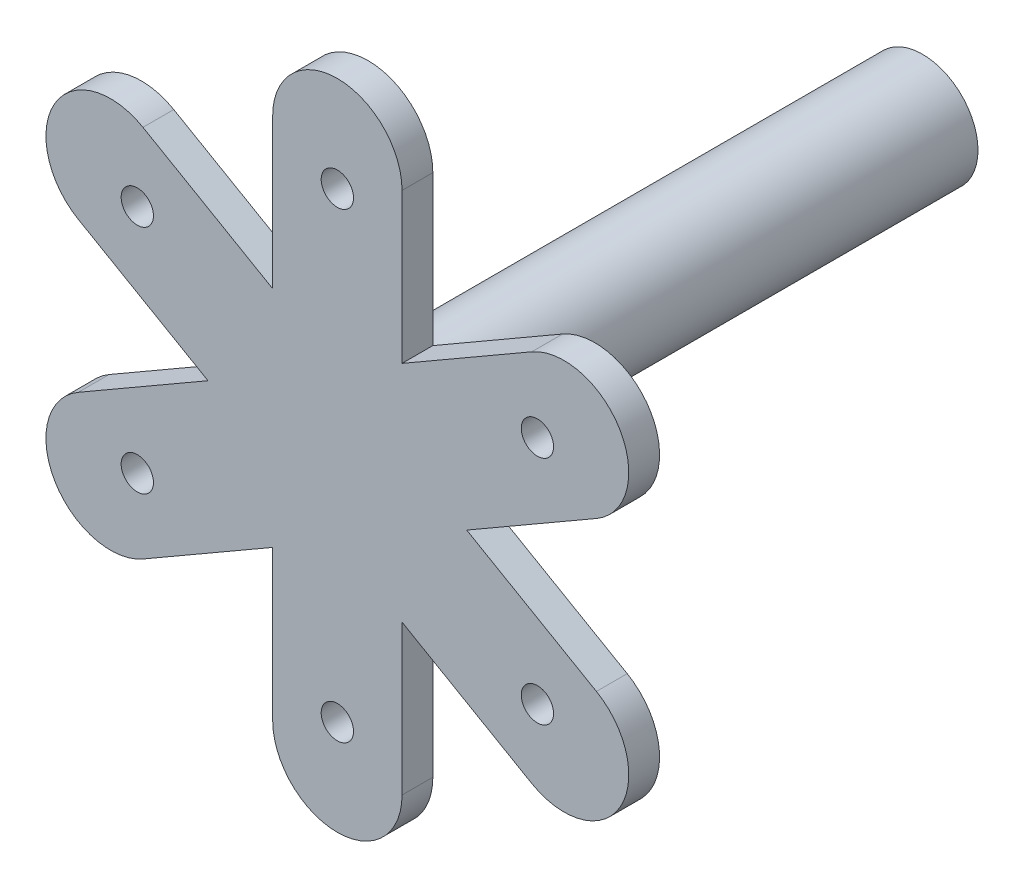
ISO-10303-21;
HEADER;
FILE_DESCRIPTION(('STEP AP214'),'2;1');
FILE_NAME('part.step','',(''),(''),'','','');
FILE_SCHEMA(('AUTOMOTIVE_DESIGN { 1 0 10303 214 1 1 1 1 }'));
ENDSEC;
DATA;
#1=APPLICATION_CONTEXT('core data for automotive mechanical design processes');
#2=APPLICATION_PROTOCOL_DEFINITION('international standard','automotive_design',2000,#1);
#3=PRODUCT_CONTEXT('',#1,'mechanical');
#4=PRODUCT('Part','Part','',(#3));
#5=PRODUCT_RELATED_PRODUCT_CATEGORY('part','',(#4));
#6=PRODUCT_DEFINITION_FORMATION('','',#4);
#7=PRODUCT_DEFINITION_CONTEXT('part definition',#1,'design');
#8=PRODUCT_DEFINITION('design','',#6,#7);
#9=PRODUCT_DEFINITION_SHAPE('','',#8);
#10=(LENGTH_UNIT() NAMED_UNIT(*) SI_UNIT(.MILLI.,.METRE.));
#11=(NAMED_UNIT(*) PLANE_ANGLE_UNIT() SI_UNIT($,.RADIAN.));
#12=(NAMED_UNIT(*) SI_UNIT($,.STERADIAN.) SOLID_ANGLE_UNIT());
#13=UNCERTAINTY_MEASURE_WITH_UNIT(LENGTH_MEASURE(1.E-05),#10,'distance_accuracy_value','');
#14=(GEOMETRIC_REPRESENTATION_CONTEXT(3) GLOBAL_UNCERTAINTY_ASSIGNED_CONTEXT((#13)) GLOBAL_UNIT_ASSIGNED_CONTEXT((#10,
#11,#12)) REPRESENTATION_CONTEXT('',''));
#15=CARTESIAN_POINT('',(0.,0.,0.));
#16=DIRECTION('',(0.,0.,1.));
#17=DIRECTION('',(1.,0.,0.));
#18=AXIS2_PLACEMENT_3D('',#15,#16,#17);
#19=CARTESIAN_POINT('',(-26.3060796608388,-45.5634665205269,10.));
#20=DIRECTION('',(0.500000000000002,0.866025403784438,0.));
#21=DIRECTION('',(-0.866025403784438,0.500000000000002,0.));
#22=AXIS2_PLACEMENT_3D('',#19,#20,#21);
#23=PLANE('',#22);
#24=DIRECTION('',(0.866025403784438,-0.500000000000002,0.));
#25=VECTOR('',#24,1.);
#26=CARTESIAN_POINT('',(-26.3060796608388,-45.5634665205269,0.));
#27=LINE('',#26,#25);
#28=CARTESIAN_POINT('',(-63.1121593216815,-24.3134665205245,0.));
#29=VERTEX_POINT('',#28);
#30=CARTESIAN_POINT('',(-21.0000000000002,-48.6269330410537,0.));
#31=VERTEX_POINT('',#30);
#32=EDGE_CURVE('E219',#29,#31,#27,.T.);
#33=ORIENTED_EDGE('',*,*,#32,.F.);
#34=DIRECTION('',(0.,0.,-1.));
#35=VECTOR('',#34,1.);
#36=CARTESIAN_POINT('',(-63.1121593216815,-24.3134665205245,10.));
#37=LINE('',#36,#35);
#38=CARTESIAN_POINT('',(-63.1121593216815,-24.3134665205245,10.));
#39=VERTEX_POINT('',#38);
#40=EDGE_CURVE('E50',#39,#29,#37,.T.);
#41=ORIENTED_EDGE('',*,*,#40,.F.);
#42=DIRECTION('',(0.866025403784438,-0.500000000000002,0.));
#43=VECTOR('',#42,1.);
#44=CARTESIAN_POINT('',(-26.3060796608388,-45.5634665205269,10.));
#45=LINE('',#44,#43);
#46=CARTESIAN_POINT('',(-21.0000000000002,-48.6269330410537,10.));
#47=VERTEX_POINT('',#46);
#48=EDGE_CURVE('E487',#39,#47,#45,.T.);
#49=ORIENTED_EDGE('',*,*,#48,.T.);
#50=DIRECTION('',(0.,0.,-1.));
#51=VECTOR('',#50,1.);
#52=CARTESIAN_POINT('',(-21.0000000000002,-48.6269330410537,10.));
#53=LINE('',#52,#51);
#54=EDGE_CURVE('E124',#47,#31,#53,.T.);
#55=ORIENTED_EDGE('',*,*,#54,.T.);
#56=EDGE_LOOP('',(#33,#41,#49,#55));
#57=FACE_BOUND('',#56,.T.);
#58=ADVANCED_FACE('F41',(#57),#23,.T.);
#59=CARTESIAN_POINT('',(-73.6121593216769,-42.4999999999996,10.));
#60=DIRECTION('',(0.,0.,-1.));
#61=DIRECTION('',(-1.,0.,0.));
#62=AXIS2_PLACEMENT_3D('',#59,#60,#61);
#63=CYLINDRICAL_SURFACE('',#62,21.);
#64=CARTESIAN_POINT('',(-73.6121593216769,-42.4999999999996,0.));
#65=DIRECTION('',(0.,0.,1.));
#66=DIRECTION('',(1.,0.,0.));
#67=AXIS2_PLACEMENT_3D('',#64,#65,#66);
#68=CIRCLE('',#67,21.);
#69=CARTESIAN_POINT('',(-84.1121593216819,-60.6865334794706,0.));
#70=VERTEX_POINT('',#69);
#71=EDGE_CURVE('E221',#29,#70,#68,.T.);
#72=ORIENTED_EDGE('',*,*,#71,.T.);
#73=DIRECTION('',(0.,0.,-1.));
#74=VECTOR('',#73,1.);
#75=CARTESIAN_POINT('',(-84.1121593216819,-60.6865334794706,10.));
#76=LINE('',#75,#74);
#77=CARTESIAN_POINT('',(-84.1121593216819,-60.6865334794706,10.));
#78=VERTEX_POINT('',#77);
#79=EDGE_CURVE('E299',#78,#70,#76,.T.);
#80=ORIENTED_EDGE('',*,*,#79,.F.);
#81=CARTESIAN_POINT('',(-73.6121593216769,-42.4999999999996,10.));
#82=DIRECTION('',(0.,0.,1.));
#83=DIRECTION('',(1.,0.,0.));
#84=AXIS2_PLACEMENT_3D('',#81,#82,#83);
#85=CIRCLE('',#84,21.);
#86=EDGE_CURVE('E306',#39,#78,#85,.T.);
#87=ORIENTED_EDGE('',*,*,#86,.F.);
#88=ORIENTED_EDGE('',*,*,#40,.T.);
#89=EDGE_LOOP('',(#72,#80,#87,#88));
#90=FACE_BOUND('',#89,.T.);
#91=ADVANCED_FACE('F303',(#90),#63,.T.);
#92=CARTESIAN_POINT('',(-47.3060796608389,-81.9365334794733,10.));
#93=DIRECTION('',(0.500000000000002,0.866025403784438,0.));
#94=DIRECTION('',(-0.866025403784438,0.500000000000002,0.));
#95=AXIS2_PLACEMENT_3D('',#92,#93,#94);
#96=PLANE('',#95);
#97=DIRECTION('',(0.866025403784438,-0.500000000000002,0.));
#98=VECTOR('',#97,1.);
#99=CARTESIAN_POINT('',(-47.3060796608389,-81.9365334794733,0.));
#100=LINE('',#99,#98);
#101=CARTESIAN_POINT('',(-41.9999999999999,-85.0000000000002,0.));
#102=VERTEX_POINT('',#101);
#103=EDGE_CURVE('E224',#70,#102,#100,.T.);
#104=ORIENTED_EDGE('',*,*,#103,.T.);
#105=DIRECTION('',(0.,0.,-1.));
#106=VECTOR('',#105,1.);
#107=CARTESIAN_POINT('',(-41.9999999999999,-85.0000000000002,10.));
#108=LINE('',#107,#106);
#109=CARTESIAN_POINT('',(-41.9999999999999,-85.0000000000002,10.));
#110=VERTEX_POINT('',#109);
#111=EDGE_CURVE('E297',#110,#102,#108,.T.);
#112=ORIENTED_EDGE('',*,*,#111,.F.);
#113=DIRECTION('',(0.866025403784438,-0.500000000000002,0.));
#114=VECTOR('',#113,1.);
#115=CARTESIAN_POINT('',(-47.3060796608389,-81.9365334794733,10.));
#116=LINE('',#115,#114);
#117=EDGE_CURVE('E441',#78,#110,#116,.T.);
#118=ORIENTED_EDGE('',*,*,#117,.F.);
#119=ORIENTED_EDGE('',*,*,#79,.T.);
#120=EDGE_LOOP('',(#104,#112,#118,#119));
#121=FACE_BOUND('',#120,.T.);
#122=ADVANCED_FACE('F313',(#121),#96,.F.);
#123=CARTESIAN_POINT('',(26.3060796608387,-45.5634665205274,10.));
#124=DIRECTION('',(-0.499999999999997,0.86602540378444,0.));
#125=DIRECTION('',(-0.866025403784441,-0.499999999999997,0.));
#126=AXIS2_PLACEMENT_3D('',#123,#124,#125);
#127=PLANE('',#126);
#128=DIRECTION('',(0.866025403784441,0.499999999999997,0.));
#129=VECTOR('',#128,1.);
#130=CARTESIAN_POINT('',(26.3060796608387,-45.5634665205274,0.));
#131=LINE('',#130,#129);
#132=CARTESIAN_POINT('',(-84.1121593216817,-109.313466520529,0.));
#133=VERTEX_POINT('',#132);
#134=EDGE_CURVE('E227',#133,#102,#131,.T.);
#135=ORIENTED_EDGE('',*,*,#134,.F.);
#136=DIRECTION('',(0.,0.,-1.));
#137=VECTOR('',#136,1.);
#138=CARTESIAN_POINT('',(-84.1121593216817,-109.313466520529,10.));
#139=LINE('',#138,#137);
#140=CARTESIAN_POINT('',(-84.1121593216817,-109.313466520529,10.));
#141=VERTEX_POINT('',#140);
#142=EDGE_CURVE('E295',#141,#133,#139,.T.);
#143=ORIENTED_EDGE('',*,*,#142,.F.);
#144=DIRECTION('',(0.866025403784441,0.499999999999997,0.));
#145=VECTOR('',#144,1.);
#146=CARTESIAN_POINT('',(26.3060796608387,-45.5634665205274,10.));
#147=LINE('',#146,#145);
#148=EDGE_CURVE('E438',#141,#110,#147,.T.);
#149=ORIENTED_EDGE('',*,*,#148,.T.);
#150=ORIENTED_EDGE('',*,*,#111,.T.);
#151=EDGE_LOOP('',(#135,#143,#149,#150));
#152=FACE_BOUND('',#151,.T.);
#153=ADVANCED_FACE('F424',(#152),#127,.T.);
#154=CARTESIAN_POINT('',(-73.6121593216775,-127.5,10.));
#155=DIRECTION('',(0.,0.,-1.));
#156=DIRECTION('',(-1.,0.,0.));
#157=AXIS2_PLACEMENT_3D('',#154,#155,#156);
#158=CYLINDRICAL_SURFACE('',#157,21.);
#159=CARTESIAN_POINT('',(-73.6121593216775,-127.5,0.));
#160=DIRECTION('',(0.,0.,1.));
#161=DIRECTION('',(1.,0.,0.));
#162=AXIS2_PLACEMENT_3D('',#159,#160,#161);
#163=CIRCLE('',#162,21.);
#164=CARTESIAN_POINT('',(-63.1121593216799,-145.686533479475,0.));
#165=VERTEX_POINT('',#164);
#166=EDGE_CURVE('E230',#133,#165,#163,.T.);
#167=ORIENTED_EDGE('',*,*,#166,.T.);
#168=DIRECTION('',(0.,0.,-1.));
#169=VECTOR('',#168,1.);
#170=CARTESIAN_POINT('',(-63.1121593216799,-145.686533479475,10.));
#171=LINE('',#170,#169);
#172=CARTESIAN_POINT('',(-63.1121593216799,-145.686533479475,10.));
#173=VERTEX_POINT('',#172);
#174=EDGE_CURVE('E292',#173,#165,#171,.T.);
#175=ORIENTED_EDGE('',*,*,#174,.F.);
#176=CARTESIAN_POINT('',(-73.6121593216775,-127.5,10.));
#177=DIRECTION('',(0.,0.,1.));
#178=DIRECTION('',(1.,0.,0.));
#179=AXIS2_PLACEMENT_3D('',#176,#177,#178);
#180=CIRCLE('',#179,21.);
#181=EDGE_CURVE('E440',#141,#173,#180,.T.);
#182=ORIENTED_EDGE('',*,*,#181,.F.);
#183=ORIENTED_EDGE('',*,*,#142,.T.);
#184=EDGE_LOOP('',(#167,#175,#182,#183));
#185=FACE_BOUND('',#184,.T.);
#186=ADVANCED_FACE('F420',(#185),#158,.T.);
#187=CARTESIAN_POINT('',(47.3060796608386,-81.9365334794736,10.));
#188=DIRECTION('',(-0.499999999999998,0.86602540378444,0.));
#189=DIRECTION('',(-0.86602540378444,-0.499999999999998,0.));
#190=AXIS2_PLACEMENT_3D('',#187,#188,#189);
#191=PLANE('',#190);
#192=DIRECTION('',(0.86602540378444,0.499999999999998,0.));
#193=VECTOR('',#192,1.);
#194=CARTESIAN_POINT('',(47.3060796608386,-81.9365334794736,0.));
#195=LINE('',#194,#193);
#196=CARTESIAN_POINT('',(-20.9999999999998,-121.373066958947,0.));
#197=VERTEX_POINT('',#196);
#198=EDGE_CURVE('E233',#165,#197,#195,.T.);
#199=ORIENTED_EDGE('',*,*,#198,.T.);
#200=DIRECTION('',(0.,0.,-1.));
#201=VECTOR('',#200,1.);
#202=CARTESIAN_POINT('',(-20.9999999999998,-121.373066958947,10.));
#203=LINE('',#202,#201);
#204=CARTESIAN_POINT('',(-20.9999999999998,-121.373066958947,10.));
#205=VERTEX_POINT('',#204);
#206=EDGE_CURVE('E290',#205,#197,#203,.T.);
#207=ORIENTED_EDGE('',*,*,#206,.F.);
#208=DIRECTION('',(0.86602540378444,0.499999999999998,0.));
#209=VECTOR('',#208,1.);
#210=CARTESIAN_POINT('',(47.3060796608386,-81.9365334794736,10.));
#211=LINE('',#210,#209);
#212=EDGE_CURVE('E443',#173,#205,#211,.T.);
#213=ORIENTED_EDGE('',*,*,#212,.F.);
#214=ORIENTED_EDGE('',*,*,#174,.T.);
#215=EDGE_LOOP('',(#199,#207,#213,#214));
#216=FACE_BOUND('',#215,.T.);
#217=ADVANCED_FACE('F416',(#216),#191,.F.);
#218=CARTESIAN_POINT('',(-20.9999999999994,0.,10.));
#219=DIRECTION('',(-1.,0.,0.));
#220=DIRECTION('',(0.,-1.,0.));
#221=AXIS2_PLACEMENT_3D('',#218,#219,#220);
#222=PLANE('',#221);
#223=DIRECTION('',(0.,1.,0.));
#224=VECTOR('',#223,1.);
#225=CARTESIAN_POINT('',(-20.9999999999994,0.,0.));
#226=LINE('',#225,#224);
#227=CARTESIAN_POINT('',(-21.,-170.000000000006,0.));
#228=VERTEX_POINT('',#227);
#229=EDGE_CURVE('E236',#228,#197,#226,.T.);
#230=ORIENTED_EDGE('',*,*,#229,.F.);
#231=DIRECTION('',(0.,0.,-1.));
#232=VECTOR('',#231,1.);
#233=CARTESIAN_POINT('',(-21.,-170.000000000006,10.));
#234=LINE('',#233,#232);
#235=CARTESIAN_POINT('',(-21.,-170.000000000006,10.));
#236=VERTEX_POINT('',#235);
#237=EDGE_CURVE('E288',#236,#228,#234,.T.);
#238=ORIENTED_EDGE('',*,*,#237,.F.);
#239=DIRECTION('',(0.,1.,0.));
#240=VECTOR('',#239,1.);
#241=CARTESIAN_POINT('',(-20.9999999999994,0.,10.));
#242=LINE('',#241,#240);
#243=EDGE_CURVE('E449',#236,#205,#242,.T.);
#244=ORIENTED_EDGE('',*,*,#243,.T.);
#245=ORIENTED_EDGE('',*,*,#206,.T.);
#246=EDGE_LOOP('',(#230,#238,#244,#245));
#247=FACE_BOUND('',#246,.T.);
#248=ADVANCED_FACE('F412',(#247),#222,.T.);
#249=CARTESIAN_POINT('',(0.,-170.000000000001,10.));
#250=DIRECTION('',(0.,0.,-1.));
#251=DIRECTION('',(-1.,0.,0.));
#252=AXIS2_PLACEMENT_3D('',#249,#250,#251);
#253=CYLINDRICAL_SURFACE('',#252,21.);
#254=CARTESIAN_POINT('',(0.,-170.000000000001,0.));
#255=DIRECTION('',(0.,0.,1.));
#256=DIRECTION('',(1.,0.,0.));
#257=AXIS2_PLACEMENT_3D('',#254,#255,#256);
#258=CIRCLE('',#257,21.);
#259=CARTESIAN_POINT('',(21.,-170.000000000003,0.));
#260=VERTEX_POINT('',#259);
#261=EDGE_CURVE('E239',#228,#260,#258,.T.);
#262=ORIENTED_EDGE('',*,*,#261,.T.);
#263=DIRECTION('',(0.,0.,-1.));
#264=VECTOR('',#263,1.);
#265=CARTESIAN_POINT('',(21.,-170.000000000003,10.));
#266=LINE('',#265,#264);
#267=CARTESIAN_POINT('',(21.,-170.000000000003,10.));
#268=VERTEX_POINT('',#267);
#269=EDGE_CURVE('E285',#268,#260,#266,.T.);
#270=ORIENTED_EDGE('',*,*,#269,.F.);
#271=CARTESIAN_POINT('',(0.,-170.000000000001,10.));
#272=DIRECTION('',(0.,0.,1.));
#273=DIRECTION('',(1.,0.,0.));
#274=AXIS2_PLACEMENT_3D('',#271,#272,#273);
#275=CIRCLE('',#274,21.);
#276=EDGE_CURVE('E452',#236,#268,#275,.T.);
#277=ORIENTED_EDGE('',*,*,#276,.F.);
#278=ORIENTED_EDGE('',*,*,#237,.T.);
#279=EDGE_LOOP('',(#262,#270,#277,#278));
#280=FACE_BOUND('',#279,.T.);
#281=ADVANCED_FACE('F408',(#280),#253,.T.);
#282=CARTESIAN_POINT('',(21.0000000000006,0.,10.));
#283=DIRECTION('',(-1.,0.,0.));
#284=DIRECTION('',(0.,-1.,0.));
#285=AXIS2_PLACEMENT_3D('',#282,#283,#284);
#286=PLANE('',#285);
#287=DIRECTION('',(0.,1.,0.));
#288=VECTOR('',#287,1.);
#289=CARTESIAN_POINT('',(21.0000000000006,0.,0.));
#290=LINE('',#289,#288);
#291=CARTESIAN_POINT('',(21.0000000000002,-121.373066958946,0.));
#292=VERTEX_POINT('',#291);
#293=EDGE_CURVE('E242',#260,#292,#290,.T.);
#294=ORIENTED_EDGE('',*,*,#293,.T.);
#295=DIRECTION('',(0.,0.,-1.));
#296=VECTOR('',#295,1.);
#297=CARTESIAN_POINT('',(21.0000000000002,-121.373066958946,10.));
#298=LINE('',#297,#296);
#299=CARTESIAN_POINT('',(21.0000000000002,-121.373066958946,10.));
#300=VERTEX_POINT('',#299);
#301=EDGE_CURVE('E283',#300,#292,#298,.T.);
#302=ORIENTED_EDGE('',*,*,#301,.F.);
#303=DIRECTION('',(0.,1.,0.));
#304=VECTOR('',#303,1.);
#305=CARTESIAN_POINT('',(21.0000000000006,0.,10.));
#306=LINE('',#305,#304);
#307=EDGE_CURVE('E455',#268,#300,#306,.T.);
#308=ORIENTED_EDGE('',*,*,#307,.F.);
#309=ORIENTED_EDGE('',*,*,#269,.T.);
#310=EDGE_LOOP('',(#294,#302,#308,#309));
#311=FACE_BOUND('',#310,.T.);
#312=ADVANCED_FACE('F404',(#311),#286,.F.);
#313=CARTESIAN_POINT('',(-47.3060796608387,-81.9365334794726,10.));
#314=DIRECTION('',(-0.500000000000003,-0.866025403784437,0.));
#315=DIRECTION('',(0.866025403784437,-0.500000000000003,0.));
#316=AXIS2_PLACEMENT_3D('',#313,#314,#315);
#317=PLANE('',#316);
#318=DIRECTION('',(-0.866025403784437,0.500000000000003,0.));
#319=VECTOR('',#318,1.);
#320=CARTESIAN_POINT('',(-47.3060796608387,-81.9365334794726,0.));
#321=LINE('',#320,#319);
#322=CARTESIAN_POINT('',(63.1121593216801,-145.686533479475,0.));
#323=VERTEX_POINT('',#322);
#324=EDGE_CURVE('E245',#323,#292,#321,.T.);
#325=ORIENTED_EDGE('',*,*,#324,.F.);
#326=DIRECTION('',(0.,0.,-1.));
#327=VECTOR('',#326,1.);
#328=CARTESIAN_POINT('',(63.1121593216801,-145.686533479475,10.));
#329=LINE('',#328,#327);
#330=CARTESIAN_POINT('',(63.1121593216801,-145.686533479475,10.));
#331=VERTEX_POINT('',#330);
#332=EDGE_CURVE('E281',#331,#323,#329,.T.);
#333=ORIENTED_EDGE('',*,*,#332,.F.);
#334=DIRECTION('',(-0.866025403784437,0.500000000000003,0.));
#335=VECTOR('',#334,1.);
#336=CARTESIAN_POINT('',(-47.3060796608387,-81.9365334794726,10.));
#337=LINE('',#336,#335);
#338=EDGE_CURVE('E457',#331,#300,#337,.T.);
#339=ORIENTED_EDGE('',*,*,#338,.T.);
#340=ORIENTED_EDGE('',*,*,#301,.T.);
#341=EDGE_LOOP('',(#325,#333,#339,#340));
#342=FACE_BOUND('',#341,.T.);
#343=ADVANCED_FACE('F400',(#342),#317,.T.);
#344=CARTESIAN_POINT('',(73.6121593216779,-127.500000000001,10.));
#345=DIRECTION('',(0.,0.,-1.));
#346=DIRECTION('',(-1.,0.,0.));
#347=AXIS2_PLACEMENT_3D('',#344,#345,#346);
#348=CYLINDRICAL_SURFACE('',#347,21.);
#349=CARTESIAN_POINT('',(73.6121593216779,-127.500000000001,0.));
#350=DIRECTION('',(0.,0.,1.));
#351=DIRECTION('',(1.,0.,0.));
#352=AXIS2_PLACEMENT_3D('',#349,#350,#351);
#353=CIRCLE('',#352,21.);
#354=CARTESIAN_POINT('',(84.1121593216803,-109.313466520528,0.));
#355=VERTEX_POINT('',#354);
#356=EDGE_CURVE('E248',#323,#355,#353,.T.);
#357=ORIENTED_EDGE('',*,*,#356,.T.);
#358=DIRECTION('',(0.,0.,-1.));
#359=VECTOR('',#358,1.);
#360=CARTESIAN_POINT('',(84.1121593216803,-109.313466520528,10.));
#361=LINE('',#360,#359);
#362=CARTESIAN_POINT('',(84.1121593216803,-109.313466520528,10.));
#363=VERTEX_POINT('',#362);
#364=EDGE_CURVE('E278',#363,#355,#361,.T.);
#365=ORIENTED_EDGE('',*,*,#364,.F.);
#366=CARTESIAN_POINT('',(73.6121593216779,-127.500000000001,10.));
#367=DIRECTION('',(0.,0.,1.));
#368=DIRECTION('',(1.,0.,0.));
#369=AXIS2_PLACEMENT_3D('',#366,#367,#368);
#370=CIRCLE('',#369,21.);
#371=EDGE_CURVE('E460',#331,#363,#370,.T.);
#372=ORIENTED_EDGE('',*,*,#371,.F.);
#373=ORIENTED_EDGE('',*,*,#332,.T.);
#374=EDGE_LOOP('',(#357,#365,#372,#373));
#375=FACE_BOUND('',#374,.T.);
#376=ADVANCED_FACE('F396',(#375),#348,.T.);
#377=CARTESIAN_POINT('',(-26.3060796608386,-45.5634665205263,10.));
#378=DIRECTION('',(-0.500000000000003,-0.866025403784437,0.));
#379=DIRECTION('',(0.866025403784437,-0.500000000000003,0.));
#380=AXIS2_PLACEMENT_3D('',#377,#378,#379);
#381=PLANE('',#380);
#382=DIRECTION('',(-0.866025403784437,0.500000000000003,0.));
#383=VECTOR('',#382,1.);
#384=CARTESIAN_POINT('',(-26.3060796608386,-45.5634665205263,0.));
#385=LINE('',#384,#383);
#386=CARTESIAN_POINT('',(42.,-84.9999999999998,0.));
#387=VERTEX_POINT('',#386);
#388=EDGE_CURVE('E251',#355,#387,#385,.T.);
#389=ORIENTED_EDGE('',*,*,#388,.T.);
#390=DIRECTION('',(0.,0.,-1.));
#391=VECTOR('',#390,1.);
#392=CARTESIAN_POINT('',(42.,-84.9999999999998,10.));
#393=LINE('',#392,#391);
#394=CARTESIAN_POINT('',(42.,-84.9999999999998,10.));
#395=VERTEX_POINT('',#394);
#396=EDGE_CURVE('E276',#395,#387,#393,.T.);
#397=ORIENTED_EDGE('',*,*,#396,.F.);
#398=DIRECTION('',(-0.866025403784437,0.500000000000003,0.));
#399=VECTOR('',#398,1.);
#400=CARTESIAN_POINT('',(-26.3060796608386,-45.5634665205263,10.));
#401=LINE('',#400,#399);
#402=EDGE_CURVE('E463',#363,#395,#401,.T.);
#403=ORIENTED_EDGE('',*,*,#402,.F.);
#404=ORIENTED_EDGE('',*,*,#364,.T.);
#405=EDGE_LOOP('',(#389,#397,#403,#404));
#406=FACE_BOUND('',#405,.T.);
#407=ADVANCED_FACE('F392',(#406),#381,.F.);
#408=CARTESIAN_POINT('',(47.3060796608383,-81.9365334794733,10.));
#409=DIRECTION('',(0.499999999999997,-0.866025403784441,0.));
#410=DIRECTION('',(0.866025403784441,0.499999999999997,0.));
#411=AXIS2_PLACEMENT_3D('',#408,#409,#410);
#412=PLANE('',#411);
#413=DIRECTION('',(-0.86602540378444,-0.499999999999997,0.));
#414=VECTOR('',#413,1.);
#415=CARTESIAN_POINT('',(47.3060796608383,-81.9365334794733,0.));
#416=LINE('',#415,#414);
#417=CARTESIAN_POINT('',(84.1121593216821,-60.6865334794704,0.));
#418=VERTEX_POINT('',#417);
#419=EDGE_CURVE('E254',#418,#387,#416,.T.);
#420=ORIENTED_EDGE('',*,*,#419,.F.);
#421=DIRECTION('',(0.,0.,-1.));
#422=VECTOR('',#421,1.);
#423=CARTESIAN_POINT('',(84.1121593216821,-60.6865334794704,10.));
#424=LINE('',#423,#422);
#425=CARTESIAN_POINT('',(84.1121593216821,-60.6865334794704,10.));
#426=VERTEX_POINT('',#425);
#427=EDGE_CURVE('E274',#426,#418,#424,.T.);
#428=ORIENTED_EDGE('',*,*,#427,.F.);
#429=DIRECTION('',(-0.86602540378444,-0.499999999999997,0.));
#430=VECTOR('',#429,1.);
#431=CARTESIAN_POINT('',(47.3060796608383,-81.9365334794733,10.));
#432=LINE('',#431,#430);
#433=EDGE_CURVE('E465',#426,#395,#432,.T.);
#434=ORIENTED_EDGE('',*,*,#433,.T.);
#435=ORIENTED_EDGE('',*,*,#396,.T.);
#436=EDGE_LOOP('',(#420,#428,#434,#435));
#437=FACE_BOUND('',#436,.T.);
#438=ADVANCED_FACE('F388',(#437),#412,.T.);
#439=CARTESIAN_POINT('',(73.6121593216778,-42.5000000000001,10.));
#440=DIRECTION('',(0.,0.,-1.));
#441=DIRECTION('',(-1.,0.,0.));
#442=AXIS2_PLACEMENT_3D('',#439,#440,#441);
#443=CYLINDRICAL_SURFACE('',#442,21.);
#444=CARTESIAN_POINT('',(73.6121593216778,-42.5000000000001,0.));
#445=DIRECTION('',(0.,0.,1.));
#446=DIRECTION('',(1.,0.,0.));
#447=AXIS2_PLACEMENT_3D('',#444,#445,#446);
#448=CIRCLE('',#447,21.);
#449=CARTESIAN_POINT('',(63.1121593216799,-24.3134665205253,0.));
#450=VERTEX_POINT('',#449);
#451=EDGE_CURVE('E257',#418,#450,#448,.T.);
#452=ORIENTED_EDGE('',*,*,#451,.T.);
#453=DIRECTION('',(0.,0.,-1.));
#454=VECTOR('',#453,1.);
#455=CARTESIAN_POINT('',(63.1121593216799,-24.3134665205253,10.));
#456=LINE('',#455,#454);
#457=CARTESIAN_POINT('',(63.1121593216799,-24.3134665205253,10.));
#458=VERTEX_POINT('',#457);
#459=EDGE_CURVE('E271',#458,#450,#456,.T.);
#460=ORIENTED_EDGE('',*,*,#459,.F.);
#461=CARTESIAN_POINT('',(73.6121593216778,-42.5000000000001,10.));
#462=DIRECTION('',(0.,0.,1.));
#463=DIRECTION('',(1.,0.,0.));
#464=AXIS2_PLACEMENT_3D('',#461,#462,#463);
#465=CIRCLE('',#464,21.);
#466=EDGE_CURVE('E195',#426,#458,#465,.T.);
#467=ORIENTED_EDGE('',*,*,#466,.F.);
#468=ORIENTED_EDGE('',*,*,#427,.T.);
#469=EDGE_LOOP('',(#452,#460,#467,#468));
#470=FACE_BOUND('',#469,.T.);
#471=ADVANCED_FACE('F384',(#470),#443,.T.);
#472=CARTESIAN_POINT('',(26.3060796608384,-45.5634665205268,10.));
#473=DIRECTION('',(0.499999999999997,-0.86602540378444,0.));
#474=DIRECTION('',(0.86602540378444,0.499999999999998,0.));
#475=AXIS2_PLACEMENT_3D('',#472,#473,#474);
#476=PLANE('',#475);
#477=DIRECTION('',(-0.86602540378444,-0.499999999999997,0.));
#478=VECTOR('',#477,1.);
#479=CARTESIAN_POINT('',(26.3060796608384,-45.5634665205268,0.));
#480=LINE('',#479,#478);
#481=CARTESIAN_POINT('',(20.9999999999999,-48.6269330410535,0.));
#482=VERTEX_POINT('',#481);
#483=EDGE_CURVE('E260',#450,#482,#480,.T.);
#484=ORIENTED_EDGE('',*,*,#483,.T.);
#485=DIRECTION('',(0.,0.,-1.));
#486=VECTOR('',#485,1.);
#487=CARTESIAN_POINT('',(20.9999999999999,-48.6269330410535,10.));
#488=LINE('',#487,#486);
#489=CARTESIAN_POINT('',(20.9999999999999,-48.6269330410535,10.));
#490=VERTEX_POINT('',#489);
#491=EDGE_CURVE('E183',#490,#482,#488,.T.);
#492=ORIENTED_EDGE('',*,*,#491,.F.);
#493=DIRECTION('',(-0.86602540378444,-0.499999999999997,0.));
#494=VECTOR('',#493,1.);
#495=CARTESIAN_POINT('',(26.3060796608384,-45.5634665205268,10.));
#496=LINE('',#495,#494);
#497=EDGE_CURVE('E192',#458,#490,#496,.T.);
#498=ORIENTED_EDGE('',*,*,#497,.F.);
#499=ORIENTED_EDGE('',*,*,#459,.T.);
#500=EDGE_LOOP('',(#484,#492,#498,#499));
#501=FACE_BOUND('',#500,.T.);
#502=ADVANCED_FACE('F381',(#501),#476,.F.);
#503=CARTESIAN_POINT('',(21.,0.,10.));
#504=DIRECTION('',(1.,0.,0.));
#505=DIRECTION('',(0.,1.,0.));
#506=AXIS2_PLACEMENT_3D('',#503,#504,#505);
#507=PLANE('',#506);
#508=DIRECTION('',(0.,-1.,0.));
#509=VECTOR('',#508,1.);
#510=CARTESIAN_POINT('',(21.,0.,0.));
#511=LINE('',#510,#509);
#512=CARTESIAN_POINT('',(21.,5.53727843648744E-12,0.));
#513=VERTEX_POINT('',#512);
#514=EDGE_CURVE('E180',#513,#482,#511,.T.);
#515=ORIENTED_EDGE('',*,*,#514,.F.);
#516=DIRECTION('',(0.,0.,-1.));
#517=VECTOR('',#516,1.);
#518=CARTESIAN_POINT('',(21.,5.53727843648744E-12,10.));
#519=LINE('',#518,#517);
#520=CARTESIAN_POINT('',(21.,5.53727843648744E-12,10.));
#521=VERTEX_POINT('',#520);
#522=EDGE_CURVE('E174',#521,#513,#519,.T.);
#523=ORIENTED_EDGE('',*,*,#522,.F.);
#524=DIRECTION('',(0.,-1.,0.));
#525=VECTOR('',#524,1.);
#526=CARTESIAN_POINT('',(21.,0.,10.));
#527=LINE('',#526,#525);
#528=EDGE_CURVE('E178',#521,#490,#527,.T.);
#529=ORIENTED_EDGE('',*,*,#528,.T.);
#530=ORIENTED_EDGE('',*,*,#491,.T.);
#531=EDGE_LOOP('',(#515,#523,#529,#530));
#532=FACE_BOUND('',#531,.T.);
#533=ADVANCED_FACE('F176',(#532),#507,.T.);
#534=CARTESIAN_POINT('',(0.,0.,10.));
#535=DIRECTION('',(0.,0.,-1.));
#536=DIRECTION('',(-1.,0.,0.));
#537=AXIS2_PLACEMENT_3D('',#534,#535,#536);
#538=CYLINDRICAL_SURFACE('',#537,21.);
#539=CARTESIAN_POINT('',(0.,0.,0.));
#540=DIRECTION('',(0.,0.,1.));
#541=DIRECTION('',(1.,0.,0.));
#542=AXIS2_PLACEMENT_3D('',#539,#540,#541);
#543=CIRCLE('',#542,21.);
#544=CARTESIAN_POINT('',(-21.,5.34237286297721E-12,0.));
#545=VERTEX_POINT('',#544);
#546=EDGE_CURVE('E264',#513,#545,#543,.T.);
#547=ORIENTED_EDGE('',*,*,#546,.T.);
#548=DIRECTION('',(0.,0.,-1.));
#549=VECTOR('',#548,1.);
#550=CARTESIAN_POINT('',(-21.,5.34237286297721E-12,10.));
#551=LINE('',#550,#549);
#552=CARTESIAN_POINT('',(-21.,5.34237286297721E-12,10.));
#553=VERTEX_POINT('',#552);
#554=EDGE_CURVE('E184',#553,#545,#551,.T.);
#555=ORIENTED_EDGE('',*,*,#554,.F.);
#556=CARTESIAN_POINT('',(0.,0.,10.));
#557=DIRECTION('',(0.,0.,1.));
#558=DIRECTION('',(1.,0.,0.));
#559=AXIS2_PLACEMENT_3D('',#556,#557,#558);
#560=CIRCLE('',#559,21.);
#561=EDGE_CURVE('E187',#521,#553,#560,.T.);
#562=ORIENTED_EDGE('',*,*,#561,.F.);
#563=ORIENTED_EDGE('',*,*,#522,.T.);
#564=EDGE_LOOP('',(#547,#555,#562,#563));
#565=FACE_BOUND('',#564,.T.);
#566=ADVANCED_FACE('F188',(#565),#538,.T.);
#567=CARTESIAN_POINT('',(64.9519052838346,-47.4999999999974,10.));
#568=DIRECTION('',(0.,0.,-1.));
#569=DIRECTION('',(-1.,0.,0.));
#570=AXIS2_PLACEMENT_3D('',#567,#568,#569);
#571=CYLINDRICAL_SURFACE('',#570,5.25);
#572=CARTESIAN_POINT('',(64.9519052838346,-47.4999999999974,10.));
#573=DIRECTION('',(0.,0.,1.));
#574=DIRECTION('',(1.,0.,0.));
#575=AXIS2_PLACEMENT_3D('',#572,#573,#574);
#576=CIRCLE('',#575,5.25);
#577=CARTESIAN_POINT('',(70.2019052838346,-47.4999999999974,10.));
#578=VERTEX_POINT('',#577);
#579=EDGE_CURVE('E489',#578,#578,#576,.T.);
#580=ORIENTED_EDGE('',*,*,#579,.T.);
#581=EDGE_LOOP('',(#580));
#582=FACE_BOUND('',#581,.T.);
#583=CARTESIAN_POINT('',(64.9519052838346,-47.4999999999974,0.));
#584=DIRECTION('',(0.,0.,1.));
#585=DIRECTION('',(1.,0.,0.));
#586=AXIS2_PLACEMENT_3D('',#583,#584,#585);
#587=CIRCLE('',#586,5.25);
#588=CARTESIAN_POINT('',(70.2019052838346,-47.4999999999974,0.));
#589=VERTEX_POINT('',#588);
#590=EDGE_CURVE('E216',#589,#589,#587,.T.);
#591=ORIENTED_EDGE('',*,*,#590,.F.);
#592=EDGE_LOOP('',(#591));
#593=FACE_BOUND('',#592,.T.);
#594=ADVANCED_FACE('F317',(#582,#593),#571,.F.);
#595=CARTESIAN_POINT('',(64.9519052838375,-122.499999999998,10.));
#596=DIRECTION('',(0.,0.,-1.));
#597=DIRECTION('',(-1.,0.,0.));
#598=AXIS2_PLACEMENT_3D('',#595,#596,#597);
#599=CYLINDRICAL_SURFACE('',#598,5.25);
#600=CARTESIAN_POINT('',(64.9519052838375,-122.499999999998,10.));
#601=DIRECTION('',(0.,0.,1.));
#602=DIRECTION('',(1.,0.,0.));
#603=AXIS2_PLACEMENT_3D('',#600,#601,#602);
#604=CIRCLE('',#603,5.25);
#605=CARTESIAN_POINT('',(70.2019052838375,-122.499999999998,10.));
#606=VERTEX_POINT('',#605);
#607=EDGE_CURVE('E492',#606,#606,#604,.T.);
#608=ORIENTED_EDGE('',*,*,#607,.T.);
#609=EDGE_LOOP('',(#608));
#610=FACE_BOUND('',#609,.T.);
#611=CARTESIAN_POINT('',(64.9519052838375,-122.499999999998,0.));
#612=DIRECTION('',(0.,0.,1.));
#613=DIRECTION('',(1.,0.,0.));
#614=AXIS2_PLACEMENT_3D('',#611,#612,#613);
#615=CIRCLE('',#614,5.25);
#616=CARTESIAN_POINT('',(70.2019052838375,-122.499999999998,0.));
#617=VERTEX_POINT('',#616);
#618=EDGE_CURVE('E213',#617,#617,#615,.T.);
#619=ORIENTED_EDGE('',*,*,#618,.F.);
#620=EDGE_LOOP('',(#619));
#621=FACE_BOUND('',#620,.T.);
#622=ADVANCED_FACE('F320',(#610,#621),#599,.F.);
#623=CARTESIAN_POINT('',(5.83564766383916E-12,-160.,10.));
#624=DIRECTION('',(0.,0.,-1.));
#625=DIRECTION('',(-1.,0.,0.));
#626=AXIS2_PLACEMENT_3D('',#623,#624,#625);
#627=CYLINDRICAL_SURFACE('',#626,5.25);
#628=CARTESIAN_POINT('',(5.83564766383916E-12,-160.,10.));
#629=DIRECTION('',(0.,0.,1.));
#630=DIRECTION('',(1.,0.,0.));
#631=AXIS2_PLACEMENT_3D('',#628,#629,#630);
#632=CIRCLE('',#631,5.25);
#633=CARTESIAN_POINT('',(5.25000000000584,-160.,10.));
#634=VERTEX_POINT('',#633);
#635=EDGE_CURVE('E495',#634,#634,#632,.T.);
#636=ORIENTED_EDGE('',*,*,#635,.T.);
#637=EDGE_LOOP('',(#636));
#638=FACE_BOUND('',#637,.T.);
#639=CARTESIAN_POINT('',(5.83564766383916E-12,-160.,0.));
#640=DIRECTION('',(0.,0.,1.));
#641=DIRECTION('',(1.,0.,0.));
#642=AXIS2_PLACEMENT_3D('',#639,#640,#641);
#643=CIRCLE('',#642,5.25);
#644=CARTESIAN_POINT('',(5.25000000000584,-160.,0.));
#645=VERTEX_POINT('',#644);
#646=EDGE_CURVE('E210',#645,#645,#643,.T.);
#647=ORIENTED_EDGE('',*,*,#646,.F.);
#648=EDGE_LOOP('',(#647));
#649=FACE_BOUND('',#648,.T.);
#650=ADVANCED_FACE('F324',(#638,#649),#627,.F.);
#651=CARTESIAN_POINT('',(-64.9519052838285,-122.500000000002,10.));
#652=DIRECTION('',(0.,0.,-1.));
#653=DIRECTION('',(-1.,0.,0.));
#654=AXIS2_PLACEMENT_3D('',#651,#652,#653);
#655=CYLINDRICAL_SURFACE('',#654,5.25);
#656=CARTESIAN_POINT('',(-64.9519052838285,-122.500000000002,10.));
#657=DIRECTION('',(0.,0.,1.));
#658=DIRECTION('',(1.,0.,0.));
#659=AXIS2_PLACEMENT_3D('',#656,#657,#658);
#660=CIRCLE('',#659,5.25);
#661=CARTESIAN_POINT('',(-59.7019052838284,-122.500000000002,10.));
#662=VERTEX_POINT('',#661);
#663=EDGE_CURVE('E498',#662,#662,#660,.T.);
#664=ORIENTED_EDGE('',*,*,#663,.T.);
#665=EDGE_LOOP('',(#664));
#666=FACE_BOUND('',#665,.T.);
#667=CARTESIAN_POINT('',(-64.9519052838285,-122.500000000002,0.));
#668=DIRECTION('',(0.,0.,1.));
#669=DIRECTION('',(1.,0.,0.));
#670=AXIS2_PLACEMENT_3D('',#667,#668,#669);
#671=CIRCLE('',#670,5.25);
#672=CARTESIAN_POINT('',(-59.7019052838284,-122.500000000002,0.));
#673=VERTEX_POINT('',#672);
#674=EDGE_CURVE('E207',#673,#673,#671,.T.);
#675=ORIENTED_EDGE('',*,*,#674,.F.);
#676=EDGE_LOOP('',(#675));
#677=FACE_BOUND('',#676,.T.);
#678=ADVANCED_FACE('F328',(#666,#677),#655,.F.);
#679=CARTESIAN_POINT('',(-64.9519052838309,-47.500000000002,10.));
#680=DIRECTION('',(0.,0.,-1.));
#681=DIRECTION('',(-1.,0.,0.));
#682=AXIS2_PLACEMENT_3D('',#679,#680,#681);
#683=CYLINDRICAL_SURFACE('',#682,5.25);
#684=CARTESIAN_POINT('',(-64.9519052838309,-47.500000000002,10.));
#685=DIRECTION('',(0.,0.,1.));
#686=DIRECTION('',(1.,0.,0.));
#687=AXIS2_PLACEMENT_3D('',#684,#685,#686);
#688=CIRCLE('',#687,5.25);
#689=CARTESIAN_POINT('',(-59.7019052838309,-47.500000000002,10.));
#690=VERTEX_POINT('',#689);
#691=EDGE_CURVE('E343',#690,#690,#688,.T.);
#692=ORIENTED_EDGE('',*,*,#691,.T.);
#693=EDGE_LOOP('',(#692));
#694=FACE_BOUND('',#693,.T.);
#695=CARTESIAN_POINT('',(-64.9519052838309,-47.500000000002,0.));
#696=DIRECTION('',(0.,0.,1.));
#697=DIRECTION('',(1.,0.,0.));
#698=AXIS2_PLACEMENT_3D('',#695,#696,#697);
#699=CIRCLE('',#698,5.25);
#700=CARTESIAN_POINT('',(-59.7019052838309,-47.500000000002,0.));
#701=VERTEX_POINT('',#700);
#702=EDGE_CURVE('E203',#701,#701,#699,.T.);
#703=ORIENTED_EDGE('',*,*,#702,.F.);
#704=EDGE_LOOP('',(#703));
#705=FACE_BOUND('',#704,.T.);
#706=ADVANCED_FACE('F331',(#694,#705),#683,.F.);
#707=CARTESIAN_POINT('',(0.,-10.,10.));
#708=DIRECTION('',(0.,0.,-1.));
#709=DIRECTION('',(-1.,0.,0.));
#710=AXIS2_PLACEMENT_3D('',#707,#708,#709);
#711=CYLINDRICAL_SURFACE('',#710,5.25);
#712=CARTESIAN_POINT('',(0.,-10.,10.));
#713=DIRECTION('',(0.,0.,1.));
#714=DIRECTION('',(1.,0.,0.));
#715=AXIS2_PLACEMENT_3D('',#712,#713,#714);
#716=CIRCLE('',#715,5.25);
#717=CARTESIAN_POINT('',(5.25,-10.,10.));
#718=VERTEX_POINT('',#717);
#719=EDGE_CURVE('E267',#718,#718,#716,.T.);
#720=ORIENTED_EDGE('',*,*,#719,.T.);
#721=EDGE_LOOP('',(#720));
#722=FACE_BOUND('',#721,.T.);
#723=CARTESIAN_POINT('',(0.,-10.,0.));
#724=DIRECTION('',(0.,0.,1.));
#725=DIRECTION('',(1.,0.,0.));
#726=AXIS2_PLACEMENT_3D('',#723,#724,#725);
#727=CIRCLE('',#726,5.25);
#728=CARTESIAN_POINT('',(5.25,-10.,0.));
#729=VERTEX_POINT('',#728);
#730=EDGE_CURVE('E200',#729,#729,#727,.T.);
#731=ORIENTED_EDGE('',*,*,#730,.F.);
#732=EDGE_LOOP('',(#731));
#733=FACE_BOUND('',#732,.T.);
#734=ADVANCED_FACE('F43',(#722,#733),#711,.F.);
#735=CARTESIAN_POINT('',(-21.,0.,10.));
#736=DIRECTION('',(1.,0.,0.));
#737=DIRECTION('',(0.,1.,0.));
#738=AXIS2_PLACEMENT_3D('',#735,#736,#737);
#739=PLANE('',#738);
#740=DIRECTION('',(0.,-1.,0.));
#741=VECTOR('',#740,1.);
#742=CARTESIAN_POINT('',(-21.,0.,0.));
#743=LINE('',#742,#741);
#744=EDGE_CURVE('E117',#545,#31,#743,.T.);
#745=ORIENTED_EDGE('',*,*,#744,.T.);
#746=ORIENTED_EDGE('',*,*,#54,.F.);
#747=DIRECTION('',(0.,-1.,0.));
#748=VECTOR('',#747,1.);
#749=CARTESIAN_POINT('',(-21.,0.,10.));
#750=LINE('',#749,#748);
#751=EDGE_CURVE('E58',#553,#47,#750,.T.);
#752=ORIENTED_EDGE('',*,*,#751,.F.);
#753=ORIENTED_EDGE('',*,*,#554,.T.);
#754=EDGE_LOOP('',(#745,#746,#752,#753));
#755=FACE_BOUND('',#754,.T.);
#756=ADVANCED_FACE('F338',(#755),#739,.F.);
#757=CARTESIAN_POINT('',(0.,0.,10.));
#758=DIRECTION('',(0.,0.,1.));
#759=DIRECTION('',(1.,0.,0.));
#760=AXIS2_PLACEMENT_3D('',#757,#758,#759);
#761=PLANE('',#760);
#762=ORIENTED_EDGE('',*,*,#719,.F.);
#763=EDGE_LOOP('',(#762));
#764=FACE_BOUND('',#763,.T.);
#765=ORIENTED_EDGE('',*,*,#691,.F.);
#766=EDGE_LOOP('',(#765));
#767=FACE_BOUND('',#766,.T.);
#768=ORIENTED_EDGE('',*,*,#663,.F.);
#769=EDGE_LOOP('',(#768));
#770=FACE_BOUND('',#769,.T.);
#771=ORIENTED_EDGE('',*,*,#635,.F.);
#772=EDGE_LOOP('',(#771));
#773=FACE_BOUND('',#772,.T.);
#774=ORIENTED_EDGE('',*,*,#607,.F.);
#775=EDGE_LOOP('',(#774));
#776=FACE_BOUND('',#775,.T.);
#777=ORIENTED_EDGE('',*,*,#579,.F.);
#778=EDGE_LOOP('',(#777));
#779=FACE_BOUND('',#778,.T.);
#780=ORIENTED_EDGE('',*,*,#48,.F.);
#781=ORIENTED_EDGE('',*,*,#86,.T.);
#782=ORIENTED_EDGE('',*,*,#117,.T.);
#783=ORIENTED_EDGE('',*,*,#148,.F.);
#784=ORIENTED_EDGE('',*,*,#181,.T.);
#785=ORIENTED_EDGE('',*,*,#212,.T.);
#786=ORIENTED_EDGE('',*,*,#243,.F.);
#787=ORIENTED_EDGE('',*,*,#276,.T.);
#788=ORIENTED_EDGE('',*,*,#307,.T.);
#789=ORIENTED_EDGE('',*,*,#338,.F.);
#790=ORIENTED_EDGE('',*,*,#371,.T.);
#791=ORIENTED_EDGE('',*,*,#402,.T.);
#792=ORIENTED_EDGE('',*,*,#433,.F.);
#793=ORIENTED_EDGE('',*,*,#466,.T.);
#794=ORIENTED_EDGE('',*,*,#497,.T.);
#795=ORIENTED_EDGE('',*,*,#528,.F.);
#796=ORIENTED_EDGE('',*,*,#561,.T.);
#797=ORIENTED_EDGE('',*,*,#751,.T.);
#798=EDGE_LOOP('',(#780,#781,#782,#783,#784,#785,#786,#787,#788,#789,#790,#791,#792,#793,#794,
#795,#796,#797));
#799=FACE_BOUND('',#798,.T.);
#800=ADVANCED_FACE('F190',(#764,#767,#770,#773,#776,#779,#799),#761,.T.);
#801=CARTESIAN_POINT('',(0.,0.,0.));
#802=DIRECTION('',(0.,0.,1.));
#803=DIRECTION('',(1.,0.,0.));
#804=AXIS2_PLACEMENT_3D('',#801,#802,#803);
#805=PLANE('',#804);
#806=CARTESIAN_POINT('',(0.,-85.2034748096311,0.));
#807=DIRECTION('',(0.,0.,1.));
#808=DIRECTION('',(1.,0.,0.));
#809=AXIS2_PLACEMENT_3D('',#806,#807,#808);
#810=CIRCLE('',#809,18.);
#811=CARTESIAN_POINT('',(17.9999999999999,-85.2034748096311,0.));
#812=VERTEX_POINT('',#811);
#813=EDGE_CURVE('E11',#812,#812,#810,.F.);
#814=ORIENTED_EDGE('',*,*,#813,.F.);
#815=EDGE_LOOP('',(#814));
#816=FACE_BOUND('',#815,.T.);
#817=ORIENTED_EDGE('',*,*,#730,.T.);
#818=EDGE_LOOP('',(#817));
#819=FACE_BOUND('',#818,.T.);
#820=ORIENTED_EDGE('',*,*,#702,.T.);
#821=EDGE_LOOP('',(#820));
#822=FACE_BOUND('',#821,.T.);
#823=ORIENTED_EDGE('',*,*,#674,.T.);
#824=EDGE_LOOP('',(#823));
#825=FACE_BOUND('',#824,.T.);
#826=ORIENTED_EDGE('',*,*,#646,.T.);
#827=EDGE_LOOP('',(#826));
#828=FACE_BOUND('',#827,.T.);
#829=ORIENTED_EDGE('',*,*,#618,.T.);
#830=EDGE_LOOP('',(#829));
#831=FACE_BOUND('',#830,.T.);
#832=ORIENTED_EDGE('',*,*,#590,.T.);
#833=EDGE_LOOP('',(#832));
#834=FACE_BOUND('',#833,.T.);
#835=ORIENTED_EDGE('',*,*,#32,.T.);
#836=ORIENTED_EDGE('',*,*,#744,.F.);
#837=ORIENTED_EDGE('',*,*,#546,.F.);
#838=ORIENTED_EDGE('',*,*,#514,.T.);
#839=ORIENTED_EDGE('',*,*,#483,.F.);
#840=ORIENTED_EDGE('',*,*,#451,.F.);
#841=ORIENTED_EDGE('',*,*,#419,.T.);
#842=ORIENTED_EDGE('',*,*,#388,.F.);
#843=ORIENTED_EDGE('',*,*,#356,.F.);
#844=ORIENTED_EDGE('',*,*,#324,.T.);
#845=ORIENTED_EDGE('',*,*,#293,.F.);
#846=ORIENTED_EDGE('',*,*,#261,.F.);
#847=ORIENTED_EDGE('',*,*,#229,.T.);
#848=ORIENTED_EDGE('',*,*,#198,.F.);
#849=ORIENTED_EDGE('',*,*,#166,.F.);
#850=ORIENTED_EDGE('',*,*,#134,.T.);
#851=ORIENTED_EDGE('',*,*,#103,.F.);
#852=ORIENTED_EDGE('',*,*,#71,.F.);
#853=EDGE_LOOP('',(#835,#836,#837,#838,#839,#840,#841,#842,#843,#844,#845,#846,#847,#848,#849,
#850,#851,#852));
#854=FACE_BOUND('',#853,.T.);
#855=ADVANCED_FACE('F307',(#816,#819,#822,#825,#828,#831,#834,#854),#805,.F.);
#856=CARTESIAN_POINT('',(0.,-85.2034748096311,-180.));
#857=DIRECTION('',(0.,0.,1.));
#858=DIRECTION('',(1.,0.,0.));
#859=AXIS2_PLACEMENT_3D('',#856,#857,#858);
#860=CYLINDRICAL_SURFACE('',#859,18.);
#861=CARTESIAN_POINT('',(0.,-85.2034748096311,-180.));
#862=DIRECTION('',(0.,0.,-1.));
#863=DIRECTION('',(-1.,0.,0.));
#864=AXIS2_PLACEMENT_3D('',#861,#862,#863);
#865=CIRCLE('',#864,18.);
#866=CARTESIAN_POINT('',(17.9999999999999,-85.2034748096311,-180.));
#867=VERTEX_POINT('',#866);
#868=EDGE_CURVE('E204',#867,#867,#865,.T.);
#869=CARTESIAN_POINT('',(17.9999999999999,-85.2034748096311,-180.));
#870=CARTESIAN_POINT('',(17.9999999999999,-85.2034748096311,-178.125));
#871=CARTESIAN_POINT('',(17.9999999999999,-85.2034748096311,-176.25));
#872=CARTESIAN_POINT('',(17.9999999999999,-85.2034748096311,-172.5));
#873=CARTESIAN_POINT('',(17.9999999999999,-85.2034748096311,-170.625));
#874=CARTESIAN_POINT('',(17.9999999999999,-85.2034748096311,-166.875));
#875=CARTESIAN_POINT('',(17.9999999999999,-85.2034748096311,-165.));
#876=CARTESIAN_POINT('',(17.9999999999999,-85.2034748096311,-161.25));
#877=CARTESIAN_POINT('',(17.9999999999999,-85.2034748096311,-159.375));
#878=CARTESIAN_POINT('',(17.9999999999999,-85.2034748096311,-155.625));
#879=CARTESIAN_POINT('',(17.9999999999999,-85.2034748096311,-153.75));
#880=CARTESIAN_POINT('',(17.9999999999999,-85.2034748096311,-150.));
#881=CARTESIAN_POINT('',(17.9999999999999,-85.2034748096311,-148.125));
#882=CARTESIAN_POINT('',(17.9999999999999,-85.2034748096311,-144.375));
#883=CARTESIAN_POINT('',(17.9999999999999,-85.2034748096311,-142.5));
#884=CARTESIAN_POINT('',(17.9999999999999,-85.2034748096311,-138.75));
#885=CARTESIAN_POINT('',(17.9999999999999,-85.2034748096311,-136.875));
#886=CARTESIAN_POINT('',(17.9999999999999,-85.2034748096311,-133.125));
#887=CARTESIAN_POINT('',(17.9999999999999,-85.2034748096311,-131.25));
#888=CARTESIAN_POINT('',(17.9999999999999,-85.2034748096311,-127.5));
#889=CARTESIAN_POINT('',(17.9999999999999,-85.2034748096311,-125.625));
#890=CARTESIAN_POINT('',(17.9999999999999,-85.2034748096311,-121.875));
#891=CARTESIAN_POINT('',(17.9999999999999,-85.2034748096311,-120.));
#892=CARTESIAN_POINT('',(17.9999999999999,-85.2034748096311,-116.25));
#893=CARTESIAN_POINT('',(17.9999999999999,-85.2034748096311,-114.375));
#894=CARTESIAN_POINT('',(17.9999999999999,-85.2034748096311,-110.625));
#895=CARTESIAN_POINT('',(17.9999999999999,-85.2034748096311,-108.75));
#896=CARTESIAN_POINT('',(17.9999999999999,-85.2034748096311,-105.));
#897=CARTESIAN_POINT('',(17.9999999999999,-85.2034748096311,-103.125));
#898=CARTESIAN_POINT('',(17.9999999999999,-85.2034748096311,-99.375));
#899=CARTESIAN_POINT('',(17.9999999999999,-85.2034748096311,-97.5));
#900=CARTESIAN_POINT('',(17.9999999999999,-85.2034748096311,-93.75));
#901=CARTESIAN_POINT('',(17.9999999999999,-85.2034748096311,-91.875));
#902=CARTESIAN_POINT('',(17.9999999999999,-85.2034748096311,-88.125));
#903=CARTESIAN_POINT('',(17.9999999999999,-85.2034748096311,-86.25));
#904=CARTESIAN_POINT('',(17.9999999999999,-85.2034748096311,-82.5));
#905=CARTESIAN_POINT('',(17.9999999999999,-85.2034748096311,-80.625));
#906=CARTESIAN_POINT('',(17.9999999999999,-85.2034748096311,-76.875));
#907=CARTESIAN_POINT('',(17.9999999999999,-85.2034748096311,-75.));
#908=CARTESIAN_POINT('',(17.9999999999999,-85.2034748096311,-71.25));
#909=CARTESIAN_POINT('',(17.9999999999999,-85.2034748096311,-69.375));
#910=CARTESIAN_POINT('',(17.9999999999999,-85.2034748096311,-65.625));
#911=CARTESIAN_POINT('',(17.9999999999999,-85.2034748096311,-63.75));
#912=CARTESIAN_POINT('',(17.9999999999999,-85.2034748096311,-60.));
#913=CARTESIAN_POINT('',(17.9999999999999,-85.2034748096311,-58.125));
#914=CARTESIAN_POINT('',(17.9999999999999,-85.2034748096311,-54.375));
#915=CARTESIAN_POINT('',(17.9999999999999,-85.2034748096311,-52.5));
#916=CARTESIAN_POINT('',(17.9999999999999,-85.2034748096311,-48.75));
#917=CARTESIAN_POINT('',(17.9999999999999,-85.2034748096311,-46.875));
#918=CARTESIAN_POINT('',(17.9999999999999,-85.2034748096311,-43.125));
#919=CARTESIAN_POINT('',(17.9999999999999,-85.2034748096311,-41.25));
#920=CARTESIAN_POINT('',(17.9999999999999,-85.2034748096311,-37.5));
#921=CARTESIAN_POINT('',(17.9999999999999,-85.2034748096311,-35.625));
#922=CARTESIAN_POINT('',(17.9999999999999,-85.2034748096311,-31.875));
#923=CARTESIAN_POINT('',(17.9999999999999,-85.2034748096311,-30.));
#924=CARTESIAN_POINT('',(17.9999999999999,-85.2034748096311,-26.25));
#925=CARTESIAN_POINT('',(17.9999999999999,-85.2034748096311,-24.375));
#926=CARTESIAN_POINT('',(17.9999999999999,-85.2034748096311,-20.625));
#927=CARTESIAN_POINT('',(17.9999999999999,-85.2034748096311,-18.75));
#928=CARTESIAN_POINT('',(17.9999999999999,-85.2034748096311,-15.));
#929=CARTESIAN_POINT('',(17.9999999999999,-85.2034748096311,-13.125));
#930=CARTESIAN_POINT('',(17.9999999999999,-85.2034748096311,-9.37500000000003));
#931=CARTESIAN_POINT('',(17.9999999999999,-85.2034748096311,-7.50000000000002));
#932=CARTESIAN_POINT('',(17.9999999999999,-85.2034748096311,-3.75000000000002));
#933=CARTESIAN_POINT('',(17.9999999999999,-85.2034748096311,-1.87500000000003));
#934=CARTESIAN_POINT('',(17.9999999999999,-85.2034748096311,0.));
#935=B_SPLINE_CURVE_WITH_KNOTS('',3,(#869,#870,#871,#872,#873,#874,#875,#876,#877,#878,#879,
#880,#881,#882,#883,#884,#885,#886,#887,#888,#889,#890,#891,#892,#893,#894,#895,#896,#897,#898,
#899,#900,#901,#902,#903,#904,#905,#906,#907,#908,#909,#910,#911,#912,#913,#914,#915,#916,#917,
#918,#919,#920,#921,#922,#923,#924,#925,#926,#927,#928,#929,#930,#931,#932,#933,#934),
.UNSPECIFIED.,.F.,.F.,(4,2,2,2,2,2,2,2,2,2,2,2,2,2,2,2,2,2,2,2,2,2,2,2,2,2,2,2,2,2,2,2,4),(0.,
5.62499999999999,11.25,16.875,22.5,28.125,33.75,39.375,45.,50.625,56.25,61.875,67.5,73.125,
78.75,84.3749999999999,90.,95.625,101.25,106.875,112.5,118.125,123.75,129.375,135.,140.625,
146.25,151.875,157.5,163.125,168.75,174.375,180.),.UNSPECIFIED.);
#936=EDGE_CURVE('BSEAM348',#867,#812,#935,.T.);
#937=ORIENTED_EDGE('',*,*,#868,.F.);
#938=ORIENTED_EDGE('',*,*,#813,.T.);
#939=ORIENTED_EDGE('',*,*,#936,.T.);
#940=ORIENTED_EDGE('',*,*,#936,.F.);
#941=EDGE_LOOP('',(#937,#939,#938,#940));
#942=FACE_BOUND('',#941,.T.);
#943=ADVANCED_FACE('F348',(#942),#860,.T.);
#944=CARTESIAN_POINT('',(0.,-85.2034748096311,-180.));
#945=DIRECTION('',(0.,0.,-1.));
#946=DIRECTION('',(-1.,0.,0.));
#947=AXIS2_PLACEMENT_3D('',#944,#945,#946);
#948=PLANE('',#947);
#949=ORIENTED_EDGE('',*,*,#868,.T.);
#950=EDGE_LOOP('',(#949));
#951=FACE_BOUND('',#950,.T.);
#952=ADVANCED_FACE('F366',(#951),#948,.T.);
#953=CLOSED_SHELL('',(#58,#91,#122,#153,#186,#217,#248,#281,#312,#343,#376,#407,#438,#471,#502,
#533,#566,#594,#622,#650,#678,#706,#734,#756,#800,#855,#943,#952));
#954=MANIFOLD_SOLID_BREP('B2',#953);
#955=ADVANCED_BREP_SHAPE_REPRESENTATION('',(#18,#954),#14);
#956=SHAPE_DEFINITION_REPRESENTATION(#9,#955);
ENDSEC;
END-ISO-10303-21;
